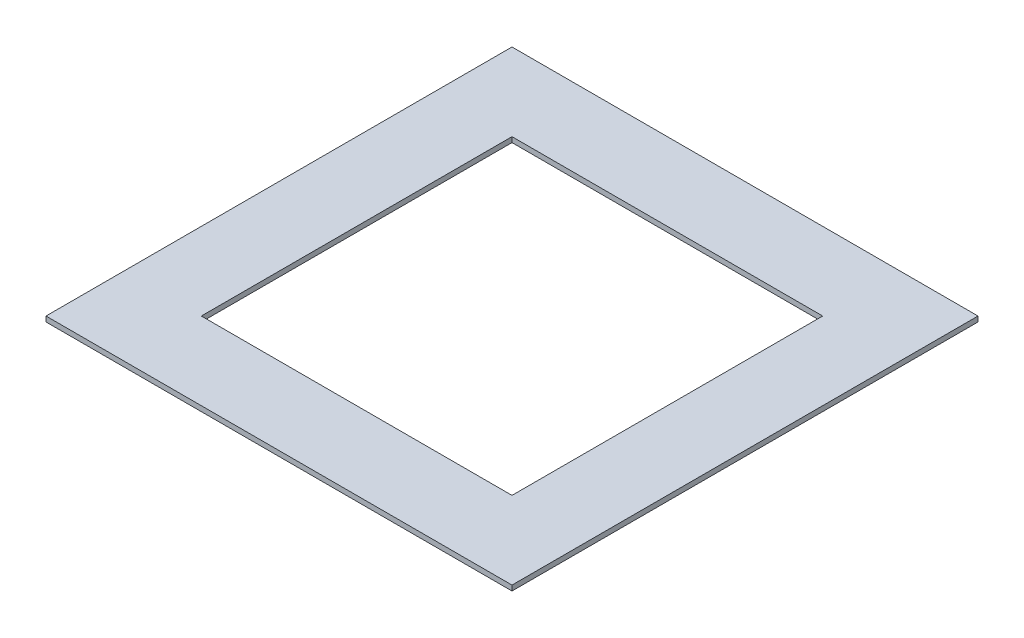
ISO-10303-21;
HEADER;
FILE_DESCRIPTION(('STEP AP214'),'2;1');
FILE_NAME('part.step','',(''),(''),'','','');
FILE_SCHEMA(('AUTOMOTIVE_DESIGN { 1 0 10303 214 1 1 1 1 }'));
ENDSEC;
DATA;
#1=APPLICATION_CONTEXT('core data for automotive mechanical design processes');
#2=APPLICATION_PROTOCOL_DEFINITION('international standard','automotive_design',2000,#1);
#3=PRODUCT_CONTEXT('',#1,'mechanical');
#4=PRODUCT('Part','Part','',(#3));
#5=PRODUCT_RELATED_PRODUCT_CATEGORY('part','',(#4));
#6=PRODUCT_DEFINITION_FORMATION('','',#4);
#7=PRODUCT_DEFINITION_CONTEXT('part definition',#1,'design');
#8=PRODUCT_DEFINITION('design','',#6,#7);
#9=PRODUCT_DEFINITION_SHAPE('','',#8);
#10=(LENGTH_UNIT() NAMED_UNIT(*) SI_UNIT(.MILLI.,.METRE.));
#11=(NAMED_UNIT(*) PLANE_ANGLE_UNIT() SI_UNIT($,.RADIAN.));
#12=(NAMED_UNIT(*) SI_UNIT($,.STERADIAN.) SOLID_ANGLE_UNIT());
#13=UNCERTAINTY_MEASURE_WITH_UNIT(LENGTH_MEASURE(1.E-05),#10,'distance_accuracy_value','');
#14=(GEOMETRIC_REPRESENTATION_CONTEXT(3) GLOBAL_UNCERTAINTY_ASSIGNED_CONTEXT((#13)) GLOBAL_UNIT_ASSIGNED_CONTEXT((#10,
#11,#12)) REPRESENTATION_CONTEXT('',''));
#15=CARTESIAN_POINT('',(0.,0.,0.));
#16=DIRECTION('',(0.,0.,1.));
#17=DIRECTION('',(1.,0.,0.));
#18=AXIS2_PLACEMENT_3D('',#15,#16,#17);
#19=CARTESIAN_POINT('',(0.,0.5,0.));
#20=DIRECTION('',(0.,-1.,0.));
#21=DIRECTION('',(0.,0.,-1.));
#22=AXIS2_PLACEMENT_3D('',#19,#20,#21);
#23=PLANE('',#22);
#24=DIRECTION('',(0.,0.,1.));
#25=VECTOR('',#24,1.);
#26=CARTESIAN_POINT('',(0.,0.5,0.));
#27=LINE('',#26,#25);
#28=CARTESIAN_POINT('',(0.,0.5,-45.));
#29=VERTEX_POINT('',#28);
#30=CARTESIAN_POINT('',(0.,0.5,0.));
#31=VERTEX_POINT('',#30);
#32=EDGE_CURVE('E134',#29,#31,#27,.T.);
#33=ORIENTED_EDGE('',*,*,#32,.T.);
#34=DIRECTION('',(1.,0.,0.));
#35=VECTOR('',#34,1.);
#36=CARTESIAN_POINT('',(0.,0.5,0.));
#37=LINE('',#36,#35);
#38=CARTESIAN_POINT('',(45.,0.5,0.));
#39=VERTEX_POINT('',#38);
#40=EDGE_CURVE('E137',#31,#39,#37,.T.);
#41=ORIENTED_EDGE('',*,*,#40,.T.);
#42=DIRECTION('',(0.,0.,-1.));
#43=VECTOR('',#42,1.);
#44=CARTESIAN_POINT('',(45.,0.5,0.));
#45=LINE('',#44,#43);
#46=CARTESIAN_POINT('',(45.,0.5,-45.));
#47=VERTEX_POINT('',#46);
#48=EDGE_CURVE('E140',#39,#47,#45,.T.);
#49=ORIENTED_EDGE('',*,*,#48,.T.);
#50=DIRECTION('',(-1.,0.,0.));
#51=VECTOR('',#50,1.);
#52=CARTESIAN_POINT('',(0.,0.5,-45.));
#53=LINE('',#52,#51);
#54=EDGE_CURVE('E142',#47,#29,#53,.T.);
#55=ORIENTED_EDGE('',*,*,#54,.T.);
#56=EDGE_LOOP('',(#33,#41,#49,#55));
#57=FACE_BOUND('',#56,.T.);
#58=DIRECTION('',(0.,0.,-1.));
#59=VECTOR('',#58,1.);
#60=CARTESIAN_POINT('',(37.5,0.5,-7.50000000000001));
#61=LINE('',#60,#59);
#62=CARTESIAN_POINT('',(37.5,0.5,-7.50000000000001));
#63=VERTEX_POINT('',#62);
#64=CARTESIAN_POINT('',(37.5,0.5,-37.5));
#65=VERTEX_POINT('',#64);
#66=EDGE_CURVE('E98',#63,#65,#61,.T.);
#67=ORIENTED_EDGE('',*,*,#66,.F.);
#68=DIRECTION('',(1.,0.,0.));
#69=VECTOR('',#68,1.);
#70=CARTESIAN_POINT('',(7.5,0.5,-7.50000000000001));
#71=LINE('',#70,#69);
#72=CARTESIAN_POINT('',(7.5,0.5,-7.50000000000001));
#73=VERTEX_POINT('',#72);
#74=EDGE_CURVE('E120',#73,#63,#71,.T.);
#75=ORIENTED_EDGE('',*,*,#74,.F.);
#76=DIRECTION('',(0.,0.,1.));
#77=VECTOR('',#76,1.);
#78=CARTESIAN_POINT('',(7.5,0.5,-7.50000000000001));
#79=LINE('',#78,#77);
#80=CARTESIAN_POINT('',(7.5,0.5,-37.5));
#81=VERTEX_POINT('',#80);
#82=EDGE_CURVE('E118',#81,#73,#79,.T.);
#83=ORIENTED_EDGE('',*,*,#82,.F.);
#84=DIRECTION('',(-1.,0.,0.));
#85=VECTOR('',#84,1.);
#86=CARTESIAN_POINT('',(7.5,0.5,-37.5));
#87=LINE('',#86,#85);
#88=EDGE_CURVE('E106',#65,#81,#87,.T.);
#89=ORIENTED_EDGE('',*,*,#88,.F.);
#90=EDGE_LOOP('',(#67,#75,#83,#89));
#91=FACE_BOUND('',#90,.T.);
#92=ADVANCED_FACE('F33',(#57,#91),#23,.F.);
#93=CARTESIAN_POINT('',(0.,0.,0.));
#94=DIRECTION('',(0.,-1.,0.));
#95=DIRECTION('',(0.,0.,-1.));
#96=AXIS2_PLACEMENT_3D('',#93,#94,#95);
#97=PLANE('',#96);
#98=DIRECTION('',(0.,0.,1.));
#99=VECTOR('',#98,1.);
#100=CARTESIAN_POINT('',(0.,0.,0.));
#101=LINE('',#100,#99);
#102=CARTESIAN_POINT('',(0.,0.,-45.));
#103=VERTEX_POINT('',#102);
#104=CARTESIAN_POINT('',(0.,0.,0.));
#105=VERTEX_POINT('',#104);
#106=EDGE_CURVE('E114',#103,#105,#101,.T.);
#107=ORIENTED_EDGE('',*,*,#106,.F.);
#108=DIRECTION('',(-1.,0.,0.));
#109=VECTOR('',#108,1.);
#110=CARTESIAN_POINT('',(0.,0.,-45.));
#111=LINE('',#110,#109);
#112=CARTESIAN_POINT('',(45.,0.,-45.));
#113=VERTEX_POINT('',#112);
#114=EDGE_CURVE('E138',#113,#103,#111,.T.);
#115=ORIENTED_EDGE('',*,*,#114,.F.);
#116=DIRECTION('',(0.,0.,-1.));
#117=VECTOR('',#116,1.);
#118=CARTESIAN_POINT('',(45.,0.,0.));
#119=LINE('',#118,#117);
#120=CARTESIAN_POINT('',(45.,0.,0.));
#121=VERTEX_POINT('',#120);
#122=EDGE_CURVE('E149',#121,#113,#119,.T.);
#123=ORIENTED_EDGE('',*,*,#122,.F.);
#124=DIRECTION('',(1.,0.,0.));
#125=VECTOR('',#124,1.);
#126=CARTESIAN_POINT('',(0.,0.,0.));
#127=LINE('',#126,#125);
#128=EDGE_CURVE('E147',#105,#121,#127,.T.);
#129=ORIENTED_EDGE('',*,*,#128,.F.);
#130=EDGE_LOOP('',(#107,#115,#123,#129));
#131=FACE_BOUND('',#130,.T.);
#132=DIRECTION('',(1.,0.,0.));
#133=VECTOR('',#132,1.);
#134=CARTESIAN_POINT('',(7.5,0.,-7.50000000000001));
#135=LINE('',#134,#133);
#136=CARTESIAN_POINT('',(7.5,0.,-7.50000000000001));
#137=VERTEX_POINT('',#136);
#138=CARTESIAN_POINT('',(37.5,0.,-7.50000000000001));
#139=VERTEX_POINT('',#138);
#140=EDGE_CURVE('E107',#137,#139,#135,.T.);
#141=ORIENTED_EDGE('',*,*,#140,.T.);
#142=DIRECTION('',(0.,0.,-1.));
#143=VECTOR('',#142,1.);
#144=CARTESIAN_POINT('',(37.5,0.,-7.50000000000001));
#145=LINE('',#144,#143);
#146=CARTESIAN_POINT('',(37.5,0.,-37.5));
#147=VERTEX_POINT('',#146);
#148=EDGE_CURVE('E56',#139,#147,#145,.T.);
#149=ORIENTED_EDGE('',*,*,#148,.T.);
#150=DIRECTION('',(-1.,0.,0.));
#151=VECTOR('',#150,1.);
#152=CARTESIAN_POINT('',(7.5,0.,-37.5));
#153=LINE('',#152,#151);
#154=CARTESIAN_POINT('',(7.5,0.,-37.5));
#155=VERTEX_POINT('',#154);
#156=EDGE_CURVE('E113',#147,#155,#153,.T.);
#157=ORIENTED_EDGE('',*,*,#156,.T.);
#158=DIRECTION('',(0.,0.,1.));
#159=VECTOR('',#158,1.);
#160=CARTESIAN_POINT('',(7.5,0.,-7.50000000000001));
#161=LINE('',#160,#159);
#162=EDGE_CURVE('E126',#155,#137,#161,.T.);
#163=ORIENTED_EDGE('',*,*,#162,.T.);
#164=EDGE_LOOP('',(#141,#149,#157,#163));
#165=FACE_BOUND('',#164,.T.);
#166=ADVANCED_FACE('F167',(#131,#165),#97,.T.);
#167=CARTESIAN_POINT('',(0.,0.5,0.));
#168=DIRECTION('',(1.,0.,0.));
#169=DIRECTION('',(0.,0.,-1.));
#170=AXIS2_PLACEMENT_3D('',#167,#168,#169);
#171=PLANE('',#170);
#172=ORIENTED_EDGE('',*,*,#106,.T.);
#173=DIRECTION('',(0.,-1.,0.));
#174=VECTOR('',#173,1.);
#175=CARTESIAN_POINT('',(0.,0.5,0.));
#176=LINE('',#175,#174);
#177=EDGE_CURVE('E11',#31,#105,#176,.T.);
#178=ORIENTED_EDGE('',*,*,#177,.F.);
#179=ORIENTED_EDGE('',*,*,#32,.F.);
#180=DIRECTION('',(0.,-1.,0.));
#181=VECTOR('',#180,1.);
#182=CARTESIAN_POINT('',(0.,0.5,-45.));
#183=LINE('',#182,#181);
#184=EDGE_CURVE('E144',#29,#103,#183,.T.);
#185=ORIENTED_EDGE('',*,*,#184,.T.);
#186=EDGE_LOOP('',(#172,#178,#179,#185));
#187=FACE_BOUND('',#186,.T.);
#188=ADVANCED_FACE('F35',(#187),#171,.F.);
#189=CARTESIAN_POINT('',(0.,0.5,0.));
#190=DIRECTION('',(0.,0.,-1.));
#191=DIRECTION('',(-1.,0.,0.));
#192=AXIS2_PLACEMENT_3D('',#189,#190,#191);
#193=PLANE('',#192);
#194=ORIENTED_EDGE('',*,*,#128,.T.);
#195=DIRECTION('',(0.,-1.,0.));
#196=VECTOR('',#195,1.);
#197=CARTESIAN_POINT('',(45.,0.5,0.));
#198=LINE('',#197,#196);
#199=EDGE_CURVE('E41',#39,#121,#198,.T.);
#200=ORIENTED_EDGE('',*,*,#199,.F.);
#201=ORIENTED_EDGE('',*,*,#40,.F.);
#202=ORIENTED_EDGE('',*,*,#177,.T.);
#203=EDGE_LOOP('',(#194,#200,#201,#202));
#204=FACE_BOUND('',#203,.T.);
#205=ADVANCED_FACE('F177',(#204),#193,.F.);
#206=CARTESIAN_POINT('',(45.,0.5,0.));
#207=DIRECTION('',(-1.,0.,0.));
#208=DIRECTION('',(0.,0.,1.));
#209=AXIS2_PLACEMENT_3D('',#206,#207,#208);
#210=PLANE('',#209);
#211=ORIENTED_EDGE('',*,*,#122,.T.);
#212=DIRECTION('',(0.,-1.,0.));
#213=VECTOR('',#212,1.);
#214=CARTESIAN_POINT('',(45.,0.5,-45.));
#215=LINE('',#214,#213);
#216=EDGE_CURVE('E154',#47,#113,#215,.T.);
#217=ORIENTED_EDGE('',*,*,#216,.F.);
#218=ORIENTED_EDGE('',*,*,#48,.F.);
#219=ORIENTED_EDGE('',*,*,#199,.T.);
#220=EDGE_LOOP('',(#211,#217,#218,#219));
#221=FACE_BOUND('',#220,.T.);
#222=ADVANCED_FACE('F161',(#221),#210,.F.);
#223=CARTESIAN_POINT('',(0.,0.5,-45.));
#224=DIRECTION('',(0.,0.,1.));
#225=DIRECTION('',(1.,0.,0.));
#226=AXIS2_PLACEMENT_3D('',#223,#224,#225);
#227=PLANE('',#226);
#228=ORIENTED_EDGE('',*,*,#114,.T.);
#229=ORIENTED_EDGE('',*,*,#184,.F.);
#230=ORIENTED_EDGE('',*,*,#54,.F.);
#231=ORIENTED_EDGE('',*,*,#216,.T.);
#232=EDGE_LOOP('',(#228,#229,#230,#231));
#233=FACE_BOUND('',#232,.T.);
#234=ADVANCED_FACE('F171',(#233),#227,.F.);
#235=CARTESIAN_POINT('',(37.5,0.5,-7.50000000000001));
#236=DIRECTION('',(-1.,0.,0.));
#237=DIRECTION('',(0.,0.,1.));
#238=AXIS2_PLACEMENT_3D('',#235,#236,#237);
#239=PLANE('',#238);
#240=ORIENTED_EDGE('',*,*,#148,.F.);
#241=DIRECTION('',(0.,-1.,0.));
#242=VECTOR('',#241,1.);
#243=CARTESIAN_POINT('',(37.5,0.5,-7.50000000000001));
#244=LINE('',#243,#242);
#245=EDGE_CURVE('E102',#63,#139,#244,.T.);
#246=ORIENTED_EDGE('',*,*,#245,.F.);
#247=ORIENTED_EDGE('',*,*,#66,.T.);
#248=DIRECTION('',(0.,-1.,0.));
#249=VECTOR('',#248,1.);
#250=CARTESIAN_POINT('',(37.5,0.5,-37.5));
#251=LINE('',#250,#249);
#252=EDGE_CURVE('E101',#65,#147,#251,.T.);
#253=ORIENTED_EDGE('',*,*,#252,.T.);
#254=EDGE_LOOP('',(#240,#246,#247,#253));
#255=FACE_BOUND('',#254,.T.);
#256=ADVANCED_FACE('F100',(#255),#239,.T.);
#257=CARTESIAN_POINT('',(7.5,0.5,-37.5));
#258=DIRECTION('',(0.,0.,1.));
#259=DIRECTION('',(1.,0.,0.));
#260=AXIS2_PLACEMENT_3D('',#257,#258,#259);
#261=PLANE('',#260);
#262=ORIENTED_EDGE('',*,*,#156,.F.);
#263=ORIENTED_EDGE('',*,*,#252,.F.);
#264=ORIENTED_EDGE('',*,*,#88,.T.);
#265=DIRECTION('',(0.,-1.,0.));
#266=VECTOR('',#265,1.);
#267=CARTESIAN_POINT('',(7.5,0.5,-37.5));
#268=LINE('',#267,#266);
#269=EDGE_CURVE('E115',#81,#155,#268,.T.);
#270=ORIENTED_EDGE('',*,*,#269,.T.);
#271=EDGE_LOOP('',(#262,#263,#264,#270));
#272=FACE_BOUND('',#271,.T.);
#273=ADVANCED_FACE('F110',(#272),#261,.T.);
#274=CARTESIAN_POINT('',(7.5,0.5,-7.50000000000001));
#275=DIRECTION('',(1.,0.,0.));
#276=DIRECTION('',(0.,0.,-1.));
#277=AXIS2_PLACEMENT_3D('',#274,#275,#276);
#278=PLANE('',#277);
#279=ORIENTED_EDGE('',*,*,#162,.F.);
#280=ORIENTED_EDGE('',*,*,#269,.F.);
#281=ORIENTED_EDGE('',*,*,#82,.T.);
#282=DIRECTION('',(0.,-1.,0.));
#283=VECTOR('',#282,1.);
#284=CARTESIAN_POINT('',(7.5,0.5,-7.50000000000001));
#285=LINE('',#284,#283);
#286=EDGE_CURVE('E48',#73,#137,#285,.T.);
#287=ORIENTED_EDGE('',*,*,#286,.T.);
#288=EDGE_LOOP('',(#279,#280,#281,#287));
#289=FACE_BOUND('',#288,.T.);
#290=ADVANCED_FACE('F200',(#289),#278,.T.);
#291=CARTESIAN_POINT('',(7.5,0.5,-7.50000000000001));
#292=DIRECTION('',(0.,0.,-1.));
#293=DIRECTION('',(-1.,0.,0.));
#294=AXIS2_PLACEMENT_3D('',#291,#292,#293);
#295=PLANE('',#294);
#296=ORIENTED_EDGE('',*,*,#140,.F.);
#297=ORIENTED_EDGE('',*,*,#286,.F.);
#298=ORIENTED_EDGE('',*,*,#74,.T.);
#299=ORIENTED_EDGE('',*,*,#245,.T.);
#300=EDGE_LOOP('',(#296,#297,#298,#299));
#301=FACE_BOUND('',#300,.T.);
#302=ADVANCED_FACE('F204',(#301),#295,.T.);
#303=CLOSED_SHELL('',(#92,#166,#188,#205,#222,#234,#256,#273,#290,#302));
#304=MANIFOLD_SOLID_BREP('B2',#303);
#305=ADVANCED_BREP_SHAPE_REPRESENTATION('',(#18,#304),#14);
#306=SHAPE_DEFINITION_REPRESENTATION(#9,#305);
ENDSEC;
END-ISO-10303-21;
